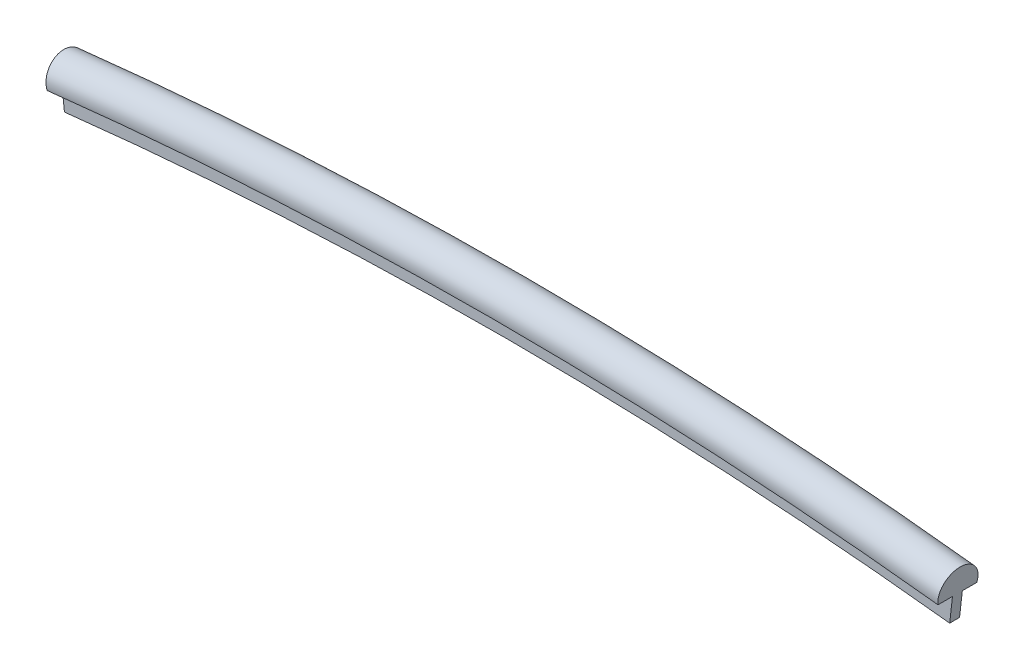
ISO-10303-21;
HEADER;
FILE_DESCRIPTION(('STEP AP214'),'2;1');
FILE_NAME('part.step','',(''),(''),'','','');
FILE_SCHEMA(('AUTOMOTIVE_DESIGN { 1 0 10303 214 1 1 1 1 }'));
ENDSEC;
DATA;
#1=APPLICATION_CONTEXT('core data for automotive mechanical design processes');
#2=APPLICATION_PROTOCOL_DEFINITION('international standard','automotive_design',2000,#1);
#3=PRODUCT_CONTEXT('',#1,'mechanical');
#4=PRODUCT('Part','Part','',(#3));
#5=PRODUCT_RELATED_PRODUCT_CATEGORY('part','',(#4));
#6=PRODUCT_DEFINITION_FORMATION('','',#4);
#7=PRODUCT_DEFINITION_CONTEXT('part definition',#1,'design');
#8=PRODUCT_DEFINITION('design','',#6,#7);
#9=PRODUCT_DEFINITION_SHAPE('','',#8);
#10=(LENGTH_UNIT() NAMED_UNIT(*) SI_UNIT(.MILLI.,.METRE.));
#11=(NAMED_UNIT(*) PLANE_ANGLE_UNIT() SI_UNIT($,.RADIAN.));
#12=(NAMED_UNIT(*) SI_UNIT($,.STERADIAN.) SOLID_ANGLE_UNIT());
#13=UNCERTAINTY_MEASURE_WITH_UNIT(LENGTH_MEASURE(1.E-05),#10,'distance_accuracy_value','');
#14=(GEOMETRIC_REPRESENTATION_CONTEXT(3) GLOBAL_UNCERTAINTY_ASSIGNED_CONTEXT((#13)) GLOBAL_UNIT_ASSIGNED_CONTEXT((#10,
#11,#12)) REPRESENTATION_CONTEXT('',''));
#15=CARTESIAN_POINT('',(0.,0.,0.));
#16=DIRECTION('',(0.,0.,1.));
#17=DIRECTION('',(1.,0.,0.));
#18=AXIS2_PLACEMENT_3D('',#15,#16,#17);
#19=CARTESIAN_POINT('',(0.,0.,70.5976415970385));
#20=DIRECTION('',(0.,0.,1.));
#21=DIRECTION('',(1.,0.,0.));
#22=AXIS2_PLACEMENT_3D('',#19,#20,#21);
#23=CYLINDRICAL_SURFACE('',#22,241.3);
#24=CARTESIAN_POINT('',(0.,0.,1.18));
#25=DIRECTION('',(0.,0.,1.));
#26=DIRECTION('',(1.,0.,0.));
#27=AXIS2_PLACEMENT_3D('',#24,#25,#26);
#28=CIRCLE('',#27,241.3);
#29=CARTESIAN_POINT('',(27.092773683107,239.774209651822,1.18));
#30=VERTEX_POINT('',#29);
#31=CARTESIAN_POINT('',(-27.092773683107,239.774209651822,1.18));
#32=VERTEX_POINT('',#31);
#33=EDGE_CURVE('E11',#30,#32,#28,.T.);
#34=ORIENTED_EDGE('',*,*,#33,.T.);
#35=DIRECTION('',(0.,0.,-1.));
#36=VECTOR('',#35,1.);
#37=CARTESIAN_POINT('',(-27.092773683107,239.774209651822,1.18));
#38=LINE('',#37,#36);
#39=CARTESIAN_POINT('',(-27.092773683107,239.774209651822,0.3));
#40=VERTEX_POINT('',#39);
#41=EDGE_CURVE('E103',#32,#40,#38,.T.);
#42=ORIENTED_EDGE('',*,*,#41,.T.);
#43=CARTESIAN_POINT('',(0.,0.,0.299999999999995));
#44=DIRECTION('',(0.,0.,1.));
#45=DIRECTION('',(1.,0.,0.));
#46=AXIS2_PLACEMENT_3D('',#43,#44,#45);
#47=CIRCLE('',#46,241.3);
#48=CARTESIAN_POINT('',(27.092773683107,239.774209651822,0.3));
#49=VERTEX_POINT('',#48);
#50=EDGE_CURVE('E85',#49,#40,#47,.T.);
#51=ORIENTED_EDGE('',*,*,#50,.F.);
#52=DIRECTION('',(0.,0.,-1.));
#53=VECTOR('',#52,1.);
#54=CARTESIAN_POINT('',(27.092773683107,239.774209651822,1.18));
#55=LINE('',#54,#53);
#56=EDGE_CURVE('E117',#30,#49,#55,.T.);
#57=ORIENTED_EDGE('',*,*,#56,.F.);
#58=EDGE_LOOP('',(#34,#42,#51,#57));
#59=FACE_BOUND('',#58,.T.);
#60=ADVANCED_FACE('F33',(#59),#23,.F.);
#61=CARTESIAN_POINT('',(0.,0.,0.));
#62=DIRECTION('',(0.,0.,1.));
#63=DIRECTION('',(1.,0.,0.));
#64=AXIS2_PLACEMENT_3D('',#61,#62,#63);
#65=TOROIDAL_SURFACE('',#64,241.586013989906,1.21416802890791);
#66=CARTESIAN_POINT('',(0.,0.,-1.18));
#67=DIRECTION('',(0.,0.,1.));
#68=DIRECTION('',(1.,0.,0.));
#69=AXIS2_PLACEMENT_3D('',#66,#67,#68);
#70=CIRCLE('',#69,241.3);
#71=CARTESIAN_POINT('',(27.092773683107,239.774209651822,-1.18));
#72=VERTEX_POINT('',#71);
#73=CARTESIAN_POINT('',(-27.092773683107,239.774209651822,-1.18));
#74=VERTEX_POINT('',#73);
#75=EDGE_CURVE('E41',#72,#74,#70,.T.);
#76=ORIENTED_EDGE('',*,*,#75,.T.);
#77=CARTESIAN_POINT('',(-27.1248868712493,240.058415115474,0.));
#78=DIRECTION('',(0.993676790931712,0.112278382441388,0.));
#79=DIRECTION('',(0.,0.,1.));
#80=AXIS2_PLACEMENT_3D('',#77,#78,#79);
#81=CIRCLE('',#80,1.21416802890791);
#82=EDGE_CURVE('E115',#74,#32,#81,.T.);
#83=ORIENTED_EDGE('',*,*,#82,.T.);
#84=ORIENTED_EDGE('',*,*,#33,.F.);
#85=CARTESIAN_POINT('',(27.1248868712493,240.058415115474,0.));
#86=DIRECTION('',(0.993676790931712,-0.112278382441388,0.));
#87=DIRECTION('',(0.,0.,1.));
#88=AXIS2_PLACEMENT_3D('',#85,#86,#87);
#89=CIRCLE('',#88,1.21416802890791);
#90=EDGE_CURVE('E97',#72,#30,#89,.T.);
#91=ORIENTED_EDGE('',*,*,#90,.F.);
#92=EDGE_LOOP('',(#76,#83,#84,#91));
#93=FACE_BOUND('',#92,.T.);
#94=ADVANCED_FACE('F35',(#93),#65,.T.);
#95=CARTESIAN_POINT('',(0.,0.,70.5976415970385));
#96=DIRECTION('',(0.,0.,1.));
#97=DIRECTION('',(1.,0.,0.));
#98=AXIS2_PLACEMENT_3D('',#95,#96,#97);
#99=CYLINDRICAL_SURFACE('',#98,241.3);
#100=CARTESIAN_POINT('',(0.,0.,-0.299999999999995));
#101=DIRECTION('',(0.,0.,1.));
#102=DIRECTION('',(1.,0.,0.));
#103=AXIS2_PLACEMENT_3D('',#100,#101,#102);
#104=CIRCLE('',#103,241.3);
#105=CARTESIAN_POINT('',(27.092773683107,239.774209651822,-0.3));
#106=VERTEX_POINT('',#105);
#107=CARTESIAN_POINT('',(-27.092773683107,239.774209651822,-0.3));
#108=VERTEX_POINT('',#107);
#109=EDGE_CURVE('E132',#106,#108,#104,.T.);
#110=ORIENTED_EDGE('',*,*,#109,.T.);
#111=DIRECTION('',(0.,0.,-1.));
#112=VECTOR('',#111,1.);
#113=CARTESIAN_POINT('',(-27.092773683107,239.774209651822,-0.3));
#114=LINE('',#113,#112);
#115=EDGE_CURVE('E113',#108,#74,#114,.T.);
#116=ORIENTED_EDGE('',*,*,#115,.T.);
#117=ORIENTED_EDGE('',*,*,#75,.F.);
#118=DIRECTION('',(0.,0.,-1.));
#119=VECTOR('',#118,1.);
#120=CARTESIAN_POINT('',(27.092773683107,239.774209651822,-0.3));
#121=LINE('',#120,#119);
#122=EDGE_CURVE('E125',#106,#72,#121,.T.);
#123=ORIENTED_EDGE('',*,*,#122,.F.);
#124=EDGE_LOOP('',(#110,#116,#117,#123));
#125=FACE_BOUND('',#124,.T.);
#126=ADVANCED_FACE('F134',(#125),#99,.F.);
#127=CARTESIAN_POINT('',(26.9243561094449,238.283694465425,-0.3));
#128=DIRECTION('',(0.,0.,1.));
#129=DIRECTION('',(1.,0.,0.));
#130=AXIS2_PLACEMENT_3D('',#127,#128,#129);
#131=PLANE('',#130);
#132=CARTESIAN_POINT('',(0.,0.,-0.299999999999995));
#133=DIRECTION('',(0.,0.,1.));
#134=DIRECTION('',(1.,0.,0.));
#135=AXIS2_PLACEMENT_3D('',#132,#133,#134);
#136=CIRCLE('',#135,239.8);
#137=CARTESIAN_POINT('',(26.9243561094449,238.283694465425,-0.3));
#138=VERTEX_POINT('',#137);
#139=CARTESIAN_POINT('',(-26.9243561094449,238.283694465425,-0.3));
#140=VERTEX_POINT('',#139);
#141=EDGE_CURVE('E129',#138,#140,#136,.T.);
#142=ORIENTED_EDGE('',*,*,#141,.T.);
#143=DIRECTION('',(-0.112278382441388,0.993676790931712,0.));
#144=VECTOR('',#143,1.);
#145=CARTESIAN_POINT('',(-26.9243561094449,238.283694465425,-0.3));
#146=LINE('',#145,#144);
#147=EDGE_CURVE('E110',#140,#108,#146,.T.);
#148=ORIENTED_EDGE('',*,*,#147,.T.);
#149=ORIENTED_EDGE('',*,*,#109,.F.);
#150=DIRECTION('',(0.112278382441388,0.993676790931712,0.));
#151=VECTOR('',#150,1.);
#152=CARTESIAN_POINT('',(26.9243561094449,238.283694465425,-0.3));
#153=LINE('',#152,#151);
#154=EDGE_CURVE('E122',#138,#106,#153,.T.);
#155=ORIENTED_EDGE('',*,*,#154,.F.);
#156=EDGE_LOOP('',(#142,#148,#149,#155));
#157=FACE_BOUND('',#156,.T.);
#158=ADVANCED_FACE('F136',(#157),#131,.F.);
#159=CARTESIAN_POINT('',(0.,0.,70.5976415970385));
#160=DIRECTION('',(0.,0.,1.));
#161=DIRECTION('',(1.,0.,0.));
#162=AXIS2_PLACEMENT_3D('',#159,#160,#161);
#163=CYLINDRICAL_SURFACE('',#162,239.8);
#164=CARTESIAN_POINT('',(0.,0.,0.299999999999995));
#165=DIRECTION('',(0.,0.,1.));
#166=DIRECTION('',(1.,0.,0.));
#167=AXIS2_PLACEMENT_3D('',#164,#165,#166);
#168=CIRCLE('',#167,239.8);
#169=CARTESIAN_POINT('',(26.9243561094449,238.283694465425,0.3));
#170=VERTEX_POINT('',#169);
#171=CARTESIAN_POINT('',(-26.9243561094449,238.283694465425,0.3));
#172=VERTEX_POINT('',#171);
#173=EDGE_CURVE('E96',#170,#172,#168,.T.);
#174=ORIENTED_EDGE('',*,*,#173,.T.);
#175=DIRECTION('',(0.,0.,-1.));
#176=VECTOR('',#175,1.);
#177=CARTESIAN_POINT('',(-26.9243561094449,238.283694465425,0.));
#178=LINE('',#177,#176);
#179=EDGE_CURVE('E105',#172,#140,#178,.T.);
#180=ORIENTED_EDGE('',*,*,#179,.T.);
#181=ORIENTED_EDGE('',*,*,#141,.F.);
#182=DIRECTION('',(0.,0.,-1.));
#183=VECTOR('',#182,1.);
#184=CARTESIAN_POINT('',(26.9243561094449,238.283694465425,0.));
#185=LINE('',#184,#183);
#186=EDGE_CURVE('E120',#170,#138,#185,.T.);
#187=ORIENTED_EDGE('',*,*,#186,.F.);
#188=EDGE_LOOP('',(#174,#180,#181,#187));
#189=FACE_BOUND('',#188,.T.);
#190=ADVANCED_FACE('F141',(#189),#163,.F.);
#191=CARTESIAN_POINT('',(26.9243561094449,238.283694465425,0.3));
#192=DIRECTION('',(0.,0.,-1.));
#193=DIRECTION('',(-1.,0.,0.));
#194=AXIS2_PLACEMENT_3D('',#191,#192,#193);
#195=PLANE('',#194);
#196=DIRECTION('',(-0.112278382441388,-0.993676790931712,0.));
#197=VECTOR('',#196,1.);
#198=CARTESIAN_POINT('',(26.9243561094449,238.283694465425,0.3));
#199=LINE('',#198,#197);
#200=EDGE_CURVE('E91',#49,#170,#199,.T.);
#201=ORIENTED_EDGE('',*,*,#200,.F.);
#202=ORIENTED_EDGE('',*,*,#50,.T.);
#203=DIRECTION('',(0.112278382441388,-0.993676790931712,0.));
#204=VECTOR('',#203,1.);
#205=CARTESIAN_POINT('',(-26.9243561094449,238.283694465425,0.3));
#206=LINE('',#205,#204);
#207=EDGE_CURVE('E88',#40,#172,#206,.T.);
#208=ORIENTED_EDGE('',*,*,#207,.T.);
#209=ORIENTED_EDGE('',*,*,#173,.F.);
#210=EDGE_LOOP('',(#201,#202,#208,#209));
#211=FACE_BOUND('',#210,.T.);
#212=ADVANCED_FACE('F87',(#211),#195,.F.);
#213=CARTESIAN_POINT('',(27.1248868712493,240.058415115474,0.));
#214=DIRECTION('',(-0.993676790931712,0.112278382441388,0.));
#215=DIRECTION('',(0.,0.,1.));
#216=AXIS2_PLACEMENT_3D('',#213,#214,#215);
#217=PLANE('',#216);
#218=ORIENTED_EDGE('',*,*,#56,.T.);
#219=ORIENTED_EDGE('',*,*,#200,.T.);
#220=ORIENTED_EDGE('',*,*,#186,.T.);
#221=ORIENTED_EDGE('',*,*,#154,.T.);
#222=ORIENTED_EDGE('',*,*,#122,.T.);
#223=ORIENTED_EDGE('',*,*,#90,.T.);
#224=EDGE_LOOP('',(#218,#219,#220,#221,#222,#223));
#225=FACE_BOUND('',#224,.T.);
#226=ADVANCED_FACE('F143',(#225),#217,.F.);
#227=CARTESIAN_POINT('',(-27.1248868712493,240.058415115474,0.));
#228=DIRECTION('',(-0.993676790931712,-0.112278382441388,0.));
#229=DIRECTION('',(0.,0.,1.));
#230=AXIS2_PLACEMENT_3D('',#227,#228,#229);
#231=PLANE('',#230);
#232=ORIENTED_EDGE('',*,*,#41,.F.);
#233=ORIENTED_EDGE('',*,*,#82,.F.);
#234=ORIENTED_EDGE('',*,*,#115,.F.);
#235=ORIENTED_EDGE('',*,*,#147,.F.);
#236=ORIENTED_EDGE('',*,*,#179,.F.);
#237=ORIENTED_EDGE('',*,*,#207,.F.);
#238=EDGE_LOOP('',(#232,#233,#234,#235,#236,#237));
#239=FACE_BOUND('',#238,.T.);
#240=ADVANCED_FACE('F101',(#239),#231,.T.);
#241=CLOSED_SHELL('',(#60,#94,#126,#158,#190,#212,#226,#240));
#242=MANIFOLD_SOLID_BREP('B2',#241);
#243=ADVANCED_BREP_SHAPE_REPRESENTATION('',(#18,#242),#14);
#244=SHAPE_DEFINITION_REPRESENTATION(#9,#243);
ENDSEC;
END-ISO-10303-21;
